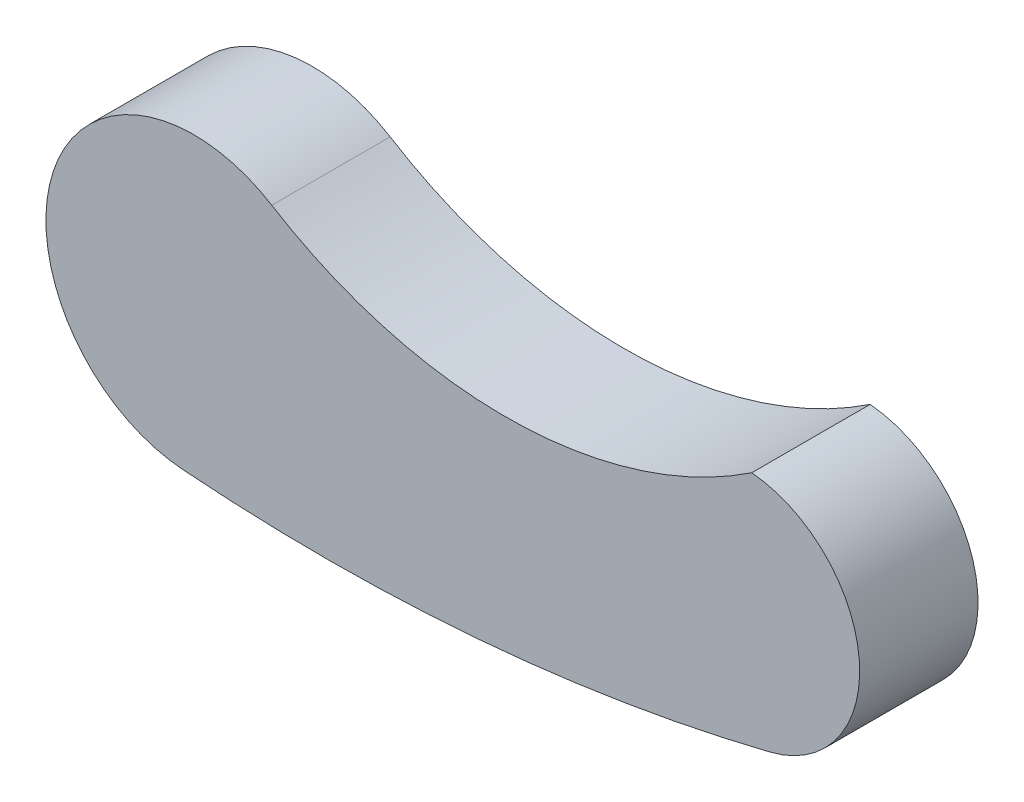
ISO-10303-21;
HEADER;
FILE_DESCRIPTION(('STEP AP214'),'2;1');
FILE_NAME('part.step','',(''),(''),'','','');
FILE_SCHEMA(('AUTOMOTIVE_DESIGN { 1 0 10303 214 1 1 1 1 }'));
ENDSEC;
DATA;
#1=APPLICATION_CONTEXT('core data for automotive mechanical design processes');
#2=APPLICATION_PROTOCOL_DEFINITION('international standard','automotive_design',2000,#1);
#3=PRODUCT_CONTEXT('',#1,'mechanical');
#4=PRODUCT('Part','Part','',(#3));
#5=PRODUCT_RELATED_PRODUCT_CATEGORY('part','',(#4));
#6=PRODUCT_DEFINITION_FORMATION('','',#4);
#7=PRODUCT_DEFINITION_CONTEXT('part definition',#1,'design');
#8=PRODUCT_DEFINITION('design','',#6,#7);
#9=PRODUCT_DEFINITION_SHAPE('','',#8);
#10=(LENGTH_UNIT() NAMED_UNIT(*) SI_UNIT(.MILLI.,.METRE.));
#11=(NAMED_UNIT(*) PLANE_ANGLE_UNIT() SI_UNIT($,.RADIAN.));
#12=(NAMED_UNIT(*) SI_UNIT($,.STERADIAN.) SOLID_ANGLE_UNIT());
#13=UNCERTAINTY_MEASURE_WITH_UNIT(LENGTH_MEASURE(1.E-05),#10,'distance_accuracy_value','');
#14=(GEOMETRIC_REPRESENTATION_CONTEXT(3) GLOBAL_UNCERTAINTY_ASSIGNED_CONTEXT((#13)) GLOBAL_UNIT_ASSIGNED_CONTEXT((#10,
#11,#12)) REPRESENTATION_CONTEXT('',''));
#15=CARTESIAN_POINT('',(0.,0.,0.));
#16=DIRECTION('',(0.,0.,1.));
#17=DIRECTION('',(1.,0.,0.));
#18=AXIS2_PLACEMENT_3D('',#15,#16,#17);
#19=CARTESIAN_POINT('',(-65.1443580185835,-38.6421093930798,185.));
#20=DIRECTION('',(0.,0.,1.));
#21=DIRECTION('',(0.525981080085574,0.850496268887765,0.));
#22=AXIS2_PLACEMENT_3D('',#19,#20,#21);
#23=CYLINDRICAL_SURFACE('',#22,20.0000000000121);
#24=CARTESIAN_POINT('',(-65.1443580185835,-38.6421093930798,201.));
#25=DIRECTION('',(0.,0.,-1.));
#26=DIRECTION('',(0.292371704722669,0.956304755963055,0.));
#27=AXIS2_PLACEMENT_3D('',#24,#25,#26);
#28=CIRCLE('',#27,20.0000000000121);
#29=CARTESIAN_POINT('',(-66.6804946541814,-58.5830292373895,201.));
#30=VERTEX_POINT('',#29);
#31=CARTESIAN_POINT('',(-54.6247364168666,-21.6321840153156,201.));
#32=VERTEX_POINT('',#31);
#33=EDGE_CURVE('E103',#30,#32,#28,.T.);
#34=ORIENTED_EDGE('',*,*,#33,.T.);
#35=DIRECTION('',(0.,0.,1.));
#36=VECTOR('',#35,1.);
#37=CARTESIAN_POINT('',(-54.6247364168666,-21.6321840153156,185.));
#38=LINE('',#37,#36);
#39=CARTESIAN_POINT('',(-54.6247364168666,-21.6321840153156,185.));
#40=VERTEX_POINT('',#39);
#41=EDGE_CURVE('E11',#40,#32,#38,.T.);
#42=ORIENTED_EDGE('',*,*,#41,.F.);
#43=CARTESIAN_POINT('',(-65.1443580185835,-38.6421093930798,185.));
#44=DIRECTION('',(0.,0.,-1.));
#45=DIRECTION('',(0.292371704722669,0.956304755963055,0.));
#46=AXIS2_PLACEMENT_3D('',#43,#44,#45);
#47=CIRCLE('',#46,20.0000000000121);
#48=CARTESIAN_POINT('',(-66.6804946541815,-58.5830292373895,185.));
#49=VERTEX_POINT('',#48);
#50=EDGE_CURVE('E89',#49,#40,#47,.T.);
#51=ORIENTED_EDGE('',*,*,#50,.F.);
#52=DIRECTION('',(0.,0.,1.));
#53=VECTOR('',#52,1.);
#54=CARTESIAN_POINT('',(-66.6804946541815,-58.5830292373895,185.));
#55=LINE('',#54,#53);
#56=EDGE_CURVE('E98',#49,#30,#55,.T.);
#57=ORIENTED_EDGE('',*,*,#56,.T.);
#58=EDGE_LOOP('',(#34,#42,#51,#57));
#59=FACE_BOUND('',#58,.T.);
#60=ADVANCED_FACE('F18',(#59),#23,.T.);
#61=CARTESIAN_POINT('',(-23.0658716117402,29.3975921179373,185.));
#62=DIRECTION('',(0.,0.,1.));
#63=DIRECTION('',(0.525981080085574,0.850496268887765,0.));
#64=AXIS2_PLACEMENT_3D('',#61,#62,#63);
#65=CYLINDRICAL_SURFACE('',#64,59.9999999999847);
#66=CARTESIAN_POINT('',(-23.0658716117402,29.3975921179373,201.));
#67=DIRECTION('',(0.,0.,1.));
#68=DIRECTION('',(0.292371704722668,0.956304755963055,0.));
#69=AXIS2_PLACEMENT_3D('',#66,#67,#68);
#70=CIRCLE('',#69,59.9999999999847);
#71=CARTESIAN_POINT('',(10.239183729184,-20.5100554797619,201.));
#72=VERTEX_POINT('',#71);
#73=EDGE_CURVE('E94',#32,#72,#70,.T.);
#74=ORIENTED_EDGE('',*,*,#73,.T.);
#75=DIRECTION('',(0.,0.,1.));
#76=VECTOR('',#75,1.);
#77=CARTESIAN_POINT('',(10.239183729184,-20.5100554797619,185.));
#78=LINE('',#77,#76);
#79=CARTESIAN_POINT('',(10.239183729184,-20.5100554797619,185.));
#80=VERTEX_POINT('',#79);
#81=EDGE_CURVE('E27',#80,#72,#78,.T.);
#82=ORIENTED_EDGE('',*,*,#81,.F.);
#83=CARTESIAN_POINT('',(-23.0658716117402,29.3975921179373,185.));
#84=DIRECTION('',(0.,0.,1.));
#85=DIRECTION('',(0.292371704722668,0.956304755963055,0.));
#86=AXIS2_PLACEMENT_3D('',#83,#84,#85);
#87=CIRCLE('',#86,59.9999999999847);
#88=EDGE_CURVE('E74',#40,#80,#87,.T.);
#89=ORIENTED_EDGE('',*,*,#88,.F.);
#90=ORIENTED_EDGE('',*,*,#41,.T.);
#91=EDGE_LOOP('',(#74,#82,#89,#90));
#92=FACE_BOUND('',#91,.T.);
#93=ADVANCED_FACE('F93',(#92),#65,.F.);
#94=CARTESIAN_POINT('',(8.82308524024965,-36.4472655577579,185.));
#95=DIRECTION('',(0.,0.,1.));
#96=DIRECTION('',(0.525981080085574,0.850496268887765,0.));
#97=AXIS2_PLACEMENT_3D('',#94,#95,#96);
#98=CYLINDRICAL_SURFACE('',#97,16.0000000000047);
#99=CARTESIAN_POINT('',(8.82308524024966,-36.4472655577579,201.));
#100=DIRECTION('',(0.,0.,-1.));
#101=DIRECTION('',(0.292371704722669,0.956304755963055,0.));
#102=AXIS2_PLACEMENT_3D('',#99,#100,#101);
#103=CIRCLE('',#102,16.0000000000047);
#104=CARTESIAN_POINT('',(12.6727858863689,-51.9772303012921,201.));
#105=VERTEX_POINT('',#104);
#106=EDGE_CURVE('E108',#72,#105,#103,.T.);
#107=ORIENTED_EDGE('',*,*,#106,.T.);
#108=DIRECTION('',(0.,0.,1.));
#109=VECTOR('',#108,1.);
#110=CARTESIAN_POINT('',(12.6727858863689,-51.9772303012921,185.));
#111=LINE('',#110,#109);
#112=CARTESIAN_POINT('',(12.6727858863689,-51.9772303012921,185.));
#113=VERTEX_POINT('',#112);
#114=EDGE_CURVE('E84',#113,#105,#111,.T.);
#115=ORIENTED_EDGE('',*,*,#114,.F.);
#116=CARTESIAN_POINT('',(8.82308524024965,-36.4472655577579,185.));
#117=DIRECTION('',(0.,0.,-1.));
#118=DIRECTION('',(0.292371704722669,0.956304755963055,0.));
#119=AXIS2_PLACEMENT_3D('',#116,#117,#118);
#120=CIRCLE('',#119,16.0000000000047);
#121=EDGE_CURVE('E80',#80,#113,#120,.T.);
#122=ORIENTED_EDGE('',*,*,#121,.F.);
#123=ORIENTED_EDGE('',*,*,#81,.T.);
#124=EDGE_LOOP('',(#107,#115,#122,#123));
#125=FACE_BOUND('',#124,.T.);
#126=ADVANCED_FACE('F82',(#125),#98,.T.);
#127=CARTESIAN_POINT('',(-47.4787867092184,190.678468816319,185.));
#128=DIRECTION('',(0.,0.,1.));
#129=DIRECTION('',(0.525981080085574,0.850496268887765,0.));
#130=AXIS2_PLACEMENT_3D('',#127,#128,#129);
#131=CYLINDRICAL_SURFACE('',#130,249.999999999965);
#132=CARTESIAN_POINT('',(-47.4787867092184,190.678468816319,201.));
#133=DIRECTION('',(0.,0.,-1.));
#134=DIRECTION('',(0.292371704722669,0.956304755963055,0.));
#135=AXIS2_PLACEMENT_3D('',#132,#133,#134);
#136=CIRCLE('',#135,249.999999999965);
#137=EDGE_CURVE('E60',#105,#30,#136,.T.);
#138=ORIENTED_EDGE('',*,*,#137,.T.);
#139=ORIENTED_EDGE('',*,*,#56,.F.);
#140=CARTESIAN_POINT('',(-47.4787867092184,190.678468816319,185.));
#141=DIRECTION('',(0.,0.,-1.));
#142=DIRECTION('',(0.292371704722669,0.956304755963055,0.));
#143=AXIS2_PLACEMENT_3D('',#140,#141,#142);
#144=CIRCLE('',#143,249.999999999965);
#145=EDGE_CURVE('E39',#113,#49,#144,.T.);
#146=ORIENTED_EDGE('',*,*,#145,.F.);
#147=ORIENTED_EDGE('',*,*,#114,.T.);
#148=EDGE_LOOP('',(#138,#139,#146,#147));
#149=FACE_BOUND('',#148,.T.);
#150=ADVANCED_FACE('F130',(#149),#131,.T.);
#151=CARTESIAN_POINT('',(-44.1051148151618,-4.62225863757125,185.));
#152=DIRECTION('',(0.,0.,1.));
#153=DIRECTION('',(0.850496268887766,-0.525981080085574,0.));
#154=AXIS2_PLACEMENT_3D('',#151,#152,#153);
#155=PLANE('',#154);
#156=ORIENTED_EDGE('',*,*,#50,.T.);
#157=ORIENTED_EDGE('',*,*,#88,.T.);
#158=ORIENTED_EDGE('',*,*,#121,.T.);
#159=ORIENTED_EDGE('',*,*,#145,.T.);
#160=EDGE_LOOP('',(#156,#157,#158,#159));
#161=FACE_BOUND('',#160,.T.);
#162=ADVANCED_FACE('F87',(#161),#155,.F.);
#163=CARTESIAN_POINT('',(-44.1051148151618,-4.62225863757125,201.));
#164=DIRECTION('',(0.,0.,1.));
#165=DIRECTION('',(0.850496268887766,-0.525981080085574,0.));
#166=AXIS2_PLACEMENT_3D('',#163,#164,#165);
#167=PLANE('',#166);
#168=ORIENTED_EDGE('',*,*,#33,.F.);
#169=ORIENTED_EDGE('',*,*,#137,.F.);
#170=ORIENTED_EDGE('',*,*,#106,.F.);
#171=ORIENTED_EDGE('',*,*,#73,.F.);
#172=EDGE_LOOP('',(#168,#169,#170,#171));
#173=FACE_BOUND('',#172,.T.);
#174=ADVANCED_FACE('F128',(#173),#167,.T.);
#175=CLOSED_SHELL('',(#60,#93,#126,#150,#162,#174));
#176=MANIFOLD_SOLID_BREP('B1',#175);
#177=ADVANCED_BREP_SHAPE_REPRESENTATION('',(#18,#176),#14);
#178=SHAPE_DEFINITION_REPRESENTATION(#9,#177);
ENDSEC;
END-ISO-10303-21;
